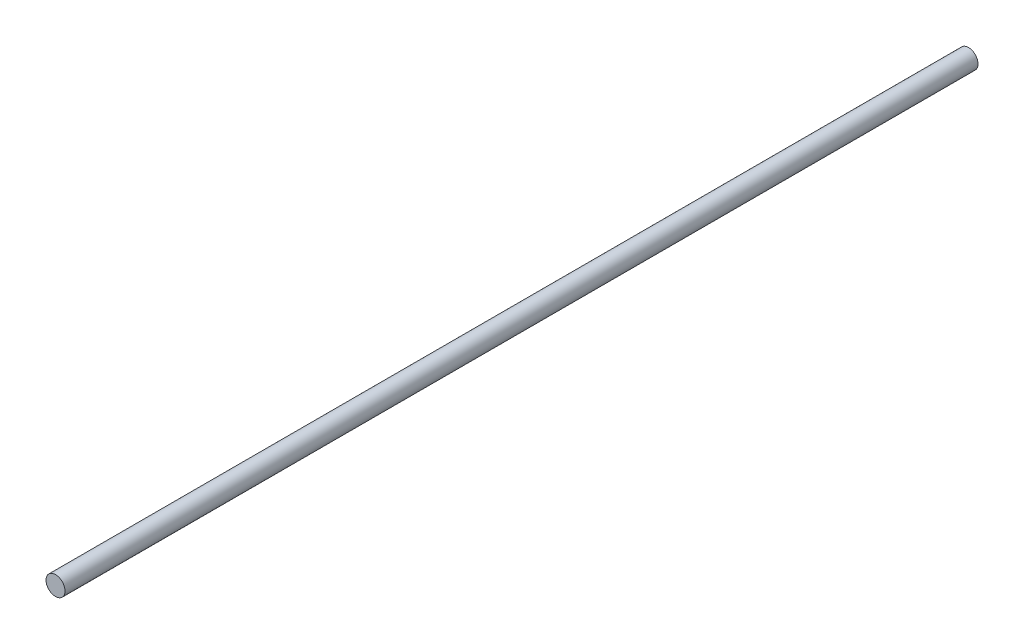
ISO-10303-21;
HEADER;
FILE_DESCRIPTION(('STEP AP214'),'2;1');
FILE_NAME('part.step','',(''),(''),'','','');
FILE_SCHEMA(('AUTOMOTIVE_DESIGN { 1 0 10303 214 1 1 1 1 }'));
ENDSEC;
DATA;
#1=APPLICATION_CONTEXT('core data for automotive mechanical design processes');
#2=APPLICATION_PROTOCOL_DEFINITION('international standard','automotive_design',2000,#1);
#3=PRODUCT_CONTEXT('',#1,'mechanical');
#4=PRODUCT('Part','Part','',(#3));
#5=PRODUCT_RELATED_PRODUCT_CATEGORY('part','',(#4));
#6=PRODUCT_DEFINITION_FORMATION('','',#4);
#7=PRODUCT_DEFINITION_CONTEXT('part definition',#1,'design');
#8=PRODUCT_DEFINITION('design','',#6,#7);
#9=PRODUCT_DEFINITION_SHAPE('','',#8);
#10=(LENGTH_UNIT() NAMED_UNIT(*) SI_UNIT(.MILLI.,.METRE.));
#11=(NAMED_UNIT(*) PLANE_ANGLE_UNIT() SI_UNIT($,.RADIAN.));
#12=(NAMED_UNIT(*) SI_UNIT($,.STERADIAN.) SOLID_ANGLE_UNIT());
#13=UNCERTAINTY_MEASURE_WITH_UNIT(LENGTH_MEASURE(1.E-05),#10,'distance_accuracy_value','');
#14=(GEOMETRIC_REPRESENTATION_CONTEXT(3) GLOBAL_UNCERTAINTY_ASSIGNED_CONTEXT((#13)) GLOBAL_UNIT_ASSIGNED_CONTEXT((#10,
#11,#12)) REPRESENTATION_CONTEXT('',''));
#15=CARTESIAN_POINT('',(0.,0.,0.));
#16=DIRECTION('',(0.,0.,1.));
#17=DIRECTION('',(1.,0.,0.));
#18=AXIS2_PLACEMENT_3D('',#15,#16,#17);
#19=CARTESIAN_POINT('',(0.,0.,609.6));
#20=DIRECTION('',(0.,0.,-1.));
#21=DIRECTION('',(-1.,0.,0.));
#22=AXIS2_PLACEMENT_3D('',#19,#20,#21);
#23=CYLINDRICAL_SURFACE('',#22,6.35);
#24=CARTESIAN_POINT('',(0.,0.,609.6));
#25=DIRECTION('',(0.,0.,1.));
#26=DIRECTION('',(1.,0.,0.));
#27=AXIS2_PLACEMENT_3D('',#24,#25,#26);
#28=CIRCLE('',#27,6.35);
#29=CARTESIAN_POINT('',(-6.35,0.,609.6));
#30=VERTEX_POINT('',#29);
#31=EDGE_CURVE('E10',#30,#30,#28,.T.);
#32=CARTESIAN_POINT('',(0.,0.,0.));
#33=DIRECTION('',(0.,0.,1.));
#34=DIRECTION('',(1.,0.,0.));
#35=AXIS2_PLACEMENT_3D('',#32,#33,#34);
#36=CIRCLE('',#35,6.35);
#37=CARTESIAN_POINT('',(-6.35,0.,0.));
#38=VERTEX_POINT('',#37);
#39=EDGE_CURVE('E40',#38,#38,#36,.T.);
#40=CARTESIAN_POINT('',(-6.35,0.,609.6));
#41=CARTESIAN_POINT('',(-6.35,0.,603.25));
#42=CARTESIAN_POINT('',(-6.35,0.,596.9));
#43=CARTESIAN_POINT('',(-6.35,0.,584.2));
#44=CARTESIAN_POINT('',(-6.35,0.,577.85));
#45=CARTESIAN_POINT('',(-6.35,0.,565.15));
#46=CARTESIAN_POINT('',(-6.35,0.,558.8));
#47=CARTESIAN_POINT('',(-6.35,0.,546.1));
#48=CARTESIAN_POINT('',(-6.35,0.,539.75));
#49=CARTESIAN_POINT('',(-6.35,0.,527.05));
#50=CARTESIAN_POINT('',(-6.35,0.,520.7));
#51=CARTESIAN_POINT('',(-6.35,0.,508.));
#52=CARTESIAN_POINT('',(-6.35,0.,501.65));
#53=CARTESIAN_POINT('',(-6.35,0.,488.95));
#54=CARTESIAN_POINT('',(-6.35,0.,482.6));
#55=CARTESIAN_POINT('',(-6.35,0.,469.9));
#56=CARTESIAN_POINT('',(-6.35,0.,463.55));
#57=CARTESIAN_POINT('',(-6.35,0.,450.85));
#58=CARTESIAN_POINT('',(-6.35,0.,444.5));
#59=CARTESIAN_POINT('',(-6.35,0.,431.8));
#60=CARTESIAN_POINT('',(-6.35,0.,425.45));
#61=CARTESIAN_POINT('',(-6.35,0.,412.75));
#62=CARTESIAN_POINT('',(-6.35,0.,406.4));
#63=CARTESIAN_POINT('',(-6.35,0.,393.7));
#64=CARTESIAN_POINT('',(-6.35,0.,387.35));
#65=CARTESIAN_POINT('',(-6.35,0.,374.65));
#66=CARTESIAN_POINT('',(-6.35,0.,368.3));
#67=CARTESIAN_POINT('',(-6.35,0.,355.6));
#68=CARTESIAN_POINT('',(-6.35,0.,349.25));
#69=CARTESIAN_POINT('',(-6.35,0.,336.55));
#70=CARTESIAN_POINT('',(-6.35,0.,330.2));
#71=CARTESIAN_POINT('',(-6.35,0.,317.5));
#72=CARTESIAN_POINT('',(-6.35,0.,311.15));
#73=CARTESIAN_POINT('',(-6.35,0.,298.45));
#74=CARTESIAN_POINT('',(-6.35,0.,292.1));
#75=CARTESIAN_POINT('',(-6.35,0.,279.4));
#76=CARTESIAN_POINT('',(-6.35,0.,273.05));
#77=CARTESIAN_POINT('',(-6.35,0.,260.35));
#78=CARTESIAN_POINT('',(-6.35,0.,254.));
#79=CARTESIAN_POINT('',(-6.35,0.,241.3));
#80=CARTESIAN_POINT('',(-6.35,0.,234.95));
#81=CARTESIAN_POINT('',(-6.35,0.,222.25));
#82=CARTESIAN_POINT('',(-6.35,0.,215.9));
#83=CARTESIAN_POINT('',(-6.35,0.,203.2));
#84=CARTESIAN_POINT('',(-6.35,0.,196.85));
#85=CARTESIAN_POINT('',(-6.35,0.,184.15));
#86=CARTESIAN_POINT('',(-6.35,0.,177.8));
#87=CARTESIAN_POINT('',(-6.35,0.,165.1));
#88=CARTESIAN_POINT('',(-6.35,0.,158.75));
#89=CARTESIAN_POINT('',(-6.35,0.,146.05));
#90=CARTESIAN_POINT('',(-6.35,0.,139.7));
#91=CARTESIAN_POINT('',(-6.35,0.,127.));
#92=CARTESIAN_POINT('',(-6.35,0.,120.65));
#93=CARTESIAN_POINT('',(-6.35,0.,107.95));
#94=CARTESIAN_POINT('',(-6.35,0.,101.6));
#95=CARTESIAN_POINT('',(-6.35,0.,88.9));
#96=CARTESIAN_POINT('',(-6.35,0.,82.5500000000001));
#97=CARTESIAN_POINT('',(-6.35,0.,69.85));
#98=CARTESIAN_POINT('',(-6.35,0.,63.5));
#99=CARTESIAN_POINT('',(-6.35,0.,50.8));
#100=CARTESIAN_POINT('',(-6.35,0.,44.45));
#101=CARTESIAN_POINT('',(-6.35,0.,31.75));
#102=CARTESIAN_POINT('',(-6.35,0.,25.4));
#103=CARTESIAN_POINT('',(-6.35,0.,12.7));
#104=CARTESIAN_POINT('',(-6.35,0.,6.35000000000001));
#105=CARTESIAN_POINT('',(-6.35,0.,0.));
#106=B_SPLINE_CURVE_WITH_KNOTS('',3,(#40,#41,#42,#43,#44,#45,#46,#47,#48,#49,#50,#51,#52,#53,
#54,#55,#56,#57,#58,#59,#60,#61,#62,#63,#64,#65,#66,#67,#68,#69,#70,#71,#72,#73,#74,#75,#76,#77,
#78,#79,#80,#81,#82,#83,#84,#85,#86,#87,#88,#89,#90,#91,#92,#93,#94,#95,#96,#97,#98,#99,#100,
#101,#102,#103,#104,#105),.UNSPECIFIED.,.F.,.F.,(4,2,2,2,2,2,2,2,2,2,2,2,2,2,2,2,2,2,2,2,2,2,2,
2,2,2,2,2,2,2,2,2,4),(0.,19.0499999999999,38.0999999999999,57.1499999999999,76.1999999999999,
95.2499999999999,114.3,133.35,152.4,171.45,190.5,209.55,228.6,247.65,266.7,285.75,304.8,323.85,
342.9,361.95,381.,400.05,419.1,438.15,457.2,476.25,495.3,514.35,533.4,552.45,571.5,590.55,
609.6),.UNSPECIFIED.);
#107=EDGE_CURVE('BSEAM37',#30,#38,#106,.T.);
#108=ORIENTED_EDGE('',*,*,#31,.F.);
#109=ORIENTED_EDGE('',*,*,#39,.T.);
#110=ORIENTED_EDGE('',*,*,#107,.T.);
#111=ORIENTED_EDGE('',*,*,#107,.F.);
#112=EDGE_LOOP('',(#108,#110,#109,#111));
#113=FACE_BOUND('',#112,.T.);
#114=ADVANCED_FACE('F37',(#113),#23,.T.);
#115=CARTESIAN_POINT('',(0.,0.,609.6));
#116=DIRECTION('',(0.,0.,1.));
#117=DIRECTION('',(1.,0.,0.));
#118=AXIS2_PLACEMENT_3D('',#115,#116,#117);
#119=PLANE('',#118);
#120=ORIENTED_EDGE('',*,*,#31,.T.);
#121=EDGE_LOOP('',(#120));
#122=FACE_BOUND('',#121,.T.);
#123=ADVANCED_FACE('F54',(#122),#119,.T.);
#124=CARTESIAN_POINT('',(0.,0.,0.));
#125=DIRECTION('',(0.,0.,1.));
#126=DIRECTION('',(1.,0.,0.));
#127=AXIS2_PLACEMENT_3D('',#124,#125,#126);
#128=PLANE('',#127);
#129=ORIENTED_EDGE('',*,*,#39,.F.);
#130=EDGE_LOOP('',(#129));
#131=FACE_BOUND('',#130,.T.);
#132=ADVANCED_FACE('F52',(#131),#128,.F.);
#133=CLOSED_SHELL('',(#114,#123,#132));
#134=MANIFOLD_SOLID_BREP('B2',#133);
#135=ADVANCED_BREP_SHAPE_REPRESENTATION('',(#18,#134),#14);
#136=SHAPE_DEFINITION_REPRESENTATION(#9,#135);
ENDSEC;
END-ISO-10303-21;
